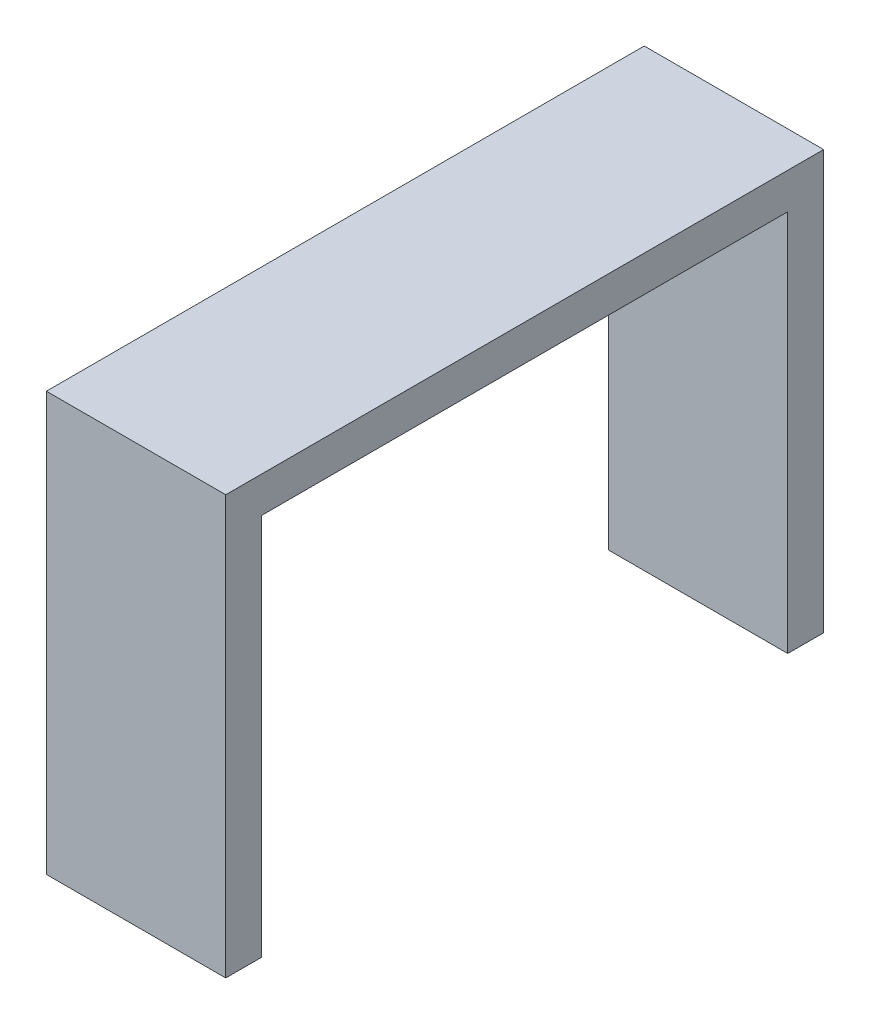
ISO-10303-21;
HEADER;
FILE_DESCRIPTION(('STEP AP214'),'2;1');
FILE_NAME('part.step','',(''),(''),'','','');
FILE_SCHEMA(('AUTOMOTIVE_DESIGN { 1 0 10303 214 1 1 1 1 }'));
ENDSEC;
DATA;
#1=APPLICATION_CONTEXT('core data for automotive mechanical design processes');
#2=APPLICATION_PROTOCOL_DEFINITION('international standard','automotive_design',2000,#1);
#3=PRODUCT_CONTEXT('',#1,'mechanical');
#4=PRODUCT('Part','Part','',(#3));
#5=PRODUCT_RELATED_PRODUCT_CATEGORY('part','',(#4));
#6=PRODUCT_DEFINITION_FORMATION('','',#4);
#7=PRODUCT_DEFINITION_CONTEXT('part definition',#1,'design');
#8=PRODUCT_DEFINITION('design','',#6,#7);
#9=PRODUCT_DEFINITION_SHAPE('','',#8);
#10=(LENGTH_UNIT() NAMED_UNIT(*) SI_UNIT(.MILLI.,.METRE.));
#11=(NAMED_UNIT(*) PLANE_ANGLE_UNIT() SI_UNIT($,.RADIAN.));
#12=(NAMED_UNIT(*) SI_UNIT($,.STERADIAN.) SOLID_ANGLE_UNIT());
#13=UNCERTAINTY_MEASURE_WITH_UNIT(LENGTH_MEASURE(1.E-05),#10,'distance_accuracy_value','');
#14=(GEOMETRIC_REPRESENTATION_CONTEXT(3) GLOBAL_UNCERTAINTY_ASSIGNED_CONTEXT((#13)) GLOBAL_UNIT_ASSIGNED_CONTEXT((#10,
#11,#12)) REPRESENTATION_CONTEXT('',''));
#15=CARTESIAN_POINT('',(0.,0.,0.));
#16=DIRECTION('',(0.,0.,1.));
#17=DIRECTION('',(1.,0.,0.));
#18=AXIS2_PLACEMENT_3D('',#15,#16,#17);
#19=CARTESIAN_POINT('',(24.3884877159542,74.,0.));
#20=DIRECTION('',(1.,0.,0.));
#21=DIRECTION('',(0.,0.,-1.));
#22=AXIS2_PLACEMENT_3D('',#19,#20,#21);
#23=PLANE('',#22);
#24=DIRECTION('',(0.,0.,1.));
#25=VECTOR('',#24,1.);
#26=CARTESIAN_POINT('',(24.3884877159542,4.,0.));
#27=LINE('',#26,#25);
#28=CARTESIAN_POINT('',(24.3884877159542,4.,-6.00000000000001));
#29=VERTEX_POINT('',#28);
#30=CARTESIAN_POINT('',(24.3884877159542,4.,0.));
#31=VERTEX_POINT('',#30);
#32=EDGE_CURVE('E11',#29,#31,#27,.T.);
#33=ORIENTED_EDGE('',*,*,#32,.T.);
#34=DIRECTION('',(0.,-1.,0.));
#35=VECTOR('',#34,1.);
#36=CARTESIAN_POINT('',(24.3884877159542,74.,0.));
#37=LINE('',#36,#35);
#38=CARTESIAN_POINT('',(24.3884877159542,74.,0.));
#39=VERTEX_POINT('',#38);
#40=EDGE_CURVE('E162',#39,#31,#37,.T.);
#41=ORIENTED_EDGE('',*,*,#40,.F.);
#42=DIRECTION('',(0.,0.,1.));
#43=VECTOR('',#42,1.);
#44=CARTESIAN_POINT('',(24.3884877159542,74.,0.));
#45=LINE('',#44,#43);
#46=CARTESIAN_POINT('',(24.3884877159542,74.,-100.));
#47=VERTEX_POINT('',#46);
#48=EDGE_CURVE('E45',#47,#39,#45,.T.);
#49=ORIENTED_EDGE('',*,*,#48,.F.);
#50=DIRECTION('',(0.,-1.,0.));
#51=VECTOR('',#50,1.);
#52=CARTESIAN_POINT('',(24.3884877159542,74.,-100.));
#53=LINE('',#52,#51);
#54=CARTESIAN_POINT('',(24.3884877159542,4.,-100.));
#55=VERTEX_POINT('',#54);
#56=EDGE_CURVE('E135',#47,#55,#53,.T.);
#57=ORIENTED_EDGE('',*,*,#56,.T.);
#58=DIRECTION('',(0.,0.,1.));
#59=VECTOR('',#58,1.);
#60=CARTESIAN_POINT('',(24.3884877159542,4.,-100.));
#61=LINE('',#60,#59);
#62=CARTESIAN_POINT('',(24.3884877159542,4.,-94.));
#63=VERTEX_POINT('',#62);
#64=EDGE_CURVE('E144',#55,#63,#61,.T.);
#65=ORIENTED_EDGE('',*,*,#64,.T.);
#66=DIRECTION('',(0.,-1.,0.));
#67=VECTOR('',#66,1.);
#68=CARTESIAN_POINT('',(24.3884877159542,74.,-94.));
#69=LINE('',#68,#67);
#70=CARTESIAN_POINT('',(24.3884877159542,68.,-94.));
#71=VERTEX_POINT('',#70);
#72=EDGE_CURVE('E152',#71,#63,#69,.T.);
#73=ORIENTED_EDGE('',*,*,#72,.F.);
#74=DIRECTION('',(0.,0.,-1.));
#75=VECTOR('',#74,1.);
#76=CARTESIAN_POINT('',(24.3884877159542,68.,0.002000000000002));
#77=LINE('',#76,#75);
#78=CARTESIAN_POINT('',(24.3884877159542,68.,-6.00000000000001));
#79=VERTEX_POINT('',#78);
#80=EDGE_CURVE('E156',#79,#71,#77,.T.);
#81=ORIENTED_EDGE('',*,*,#80,.F.);
#82=DIRECTION('',(0.,-1.,0.));
#83=VECTOR('',#82,1.);
#84=CARTESIAN_POINT('',(24.3884877159542,74.,-6.00000000000001));
#85=LINE('',#84,#83);
#86=EDGE_CURVE('E87',#79,#29,#85,.T.);
#87=ORIENTED_EDGE('',*,*,#86,.T.);
#88=EDGE_LOOP('',(#33,#41,#49,#57,#65,#73,#81,#87));
#89=FACE_BOUND('',#88,.T.);
#90=ADVANCED_FACE('F41',(#89),#23,.F.);
#91=CARTESIAN_POINT('',(24.3884877159542,74.,0.));
#92=DIRECTION('',(0.,0.,-1.));
#93=DIRECTION('',(-1.,0.,0.));
#94=AXIS2_PLACEMENT_3D('',#91,#92,#93);
#95=PLANE('',#94);
#96=DIRECTION('',(1.,0.,0.));
#97=VECTOR('',#96,1.);
#98=CARTESIAN_POINT('',(24.3884877159542,4.,0.));
#99=LINE('',#98,#97);
#100=CARTESIAN_POINT('',(54.3884877159542,4.,0.));
#101=VERTEX_POINT('',#100);
#102=EDGE_CURVE('E50',#31,#101,#99,.T.);
#103=ORIENTED_EDGE('',*,*,#102,.T.);
#104=DIRECTION('',(0.,-1.,0.));
#105=VECTOR('',#104,1.);
#106=CARTESIAN_POINT('',(54.3884877159542,74.,0.));
#107=LINE('',#106,#105);
#108=CARTESIAN_POINT('',(54.3884877159542,74.,0.));
#109=VERTEX_POINT('',#108);
#110=EDGE_CURVE('E164',#109,#101,#107,.T.);
#111=ORIENTED_EDGE('',*,*,#110,.F.);
#112=DIRECTION('',(1.,0.,0.));
#113=VECTOR('',#112,1.);
#114=CARTESIAN_POINT('',(24.3884877159542,74.,0.));
#115=LINE('',#114,#113);
#116=EDGE_CURVE('E80',#39,#109,#115,.T.);
#117=ORIENTED_EDGE('',*,*,#116,.F.);
#118=ORIENTED_EDGE('',*,*,#40,.T.);
#119=EDGE_LOOP('',(#103,#111,#117,#118));
#120=FACE_BOUND('',#119,.T.);
#121=ADVANCED_FACE('F174',(#120),#95,.F.);
#122=CARTESIAN_POINT('',(54.3884877159542,74.,0.));
#123=DIRECTION('',(-1.,0.,0.));
#124=DIRECTION('',(0.,0.,1.));
#125=AXIS2_PLACEMENT_3D('',#122,#123,#124);
#126=PLANE('',#125);
#127=DIRECTION('',(0.,0.,-1.));
#128=VECTOR('',#127,1.);
#129=CARTESIAN_POINT('',(54.3884877159542,4.,0.));
#130=LINE('',#129,#128);
#131=CARTESIAN_POINT('',(54.3884877159542,4.,-6.00000000000001));
#132=VERTEX_POINT('',#131);
#133=EDGE_CURVE('E171',#101,#132,#130,.T.);
#134=ORIENTED_EDGE('',*,*,#133,.T.);
#135=DIRECTION('',(0.,-1.,0.));
#136=VECTOR('',#135,1.);
#137=CARTESIAN_POINT('',(54.3884877159542,74.,-6.00000000000001));
#138=LINE('',#137,#136);
#139=CARTESIAN_POINT('',(54.3884877159542,68.,-6.00000000000001));
#140=VERTEX_POINT('',#139);
#141=EDGE_CURVE('E166',#140,#132,#138,.T.);
#142=ORIENTED_EDGE('',*,*,#141,.F.);
#143=DIRECTION('',(0.,0.,-1.));
#144=VECTOR('',#143,1.);
#145=CARTESIAN_POINT('',(54.3884877159542,68.,0.002000000000002));
#146=LINE('',#145,#144);
#147=CARTESIAN_POINT('',(54.3884877159542,68.,-94.));
#148=VERTEX_POINT('',#147);
#149=EDGE_CURVE('E58',#140,#148,#146,.T.);
#150=ORIENTED_EDGE('',*,*,#149,.T.);
#151=DIRECTION('',(0.,-1.,0.));
#152=VECTOR('',#151,1.);
#153=CARTESIAN_POINT('',(54.3884877159542,74.,-94.));
#154=LINE('',#153,#152);
#155=CARTESIAN_POINT('',(54.3884877159542,4.,-94.));
#156=VERTEX_POINT('',#155);
#157=EDGE_CURVE('E134',#148,#156,#154,.T.);
#158=ORIENTED_EDGE('',*,*,#157,.T.);
#159=DIRECTION('',(0.,0.,-1.));
#160=VECTOR('',#159,1.);
#161=CARTESIAN_POINT('',(54.3884877159542,4.,-100.));
#162=LINE('',#161,#160);
#163=CARTESIAN_POINT('',(54.3884877159542,4.,-100.));
#164=VERTEX_POINT('',#163);
#165=EDGE_CURVE('E131',#156,#164,#162,.T.);
#166=ORIENTED_EDGE('',*,*,#165,.T.);
#167=DIRECTION('',(0.,-1.,0.));
#168=VECTOR('',#167,1.);
#169=CARTESIAN_POINT('',(54.3884877159542,74.,-100.));
#170=LINE('',#169,#168);
#171=CARTESIAN_POINT('',(54.3884877159542,74.,-100.));
#172=VERTEX_POINT('',#171);
#173=EDGE_CURVE('E127',#172,#164,#170,.T.);
#174=ORIENTED_EDGE('',*,*,#173,.F.);
#175=DIRECTION('',(0.,0.,-1.));
#176=VECTOR('',#175,1.);
#177=CARTESIAN_POINT('',(54.3884877159542,74.,0.));
#178=LINE('',#177,#176);
#179=EDGE_CURVE('E118',#109,#172,#178,.T.);
#180=ORIENTED_EDGE('',*,*,#179,.F.);
#181=ORIENTED_EDGE('',*,*,#110,.T.);
#182=EDGE_LOOP('',(#134,#142,#150,#158,#166,#174,#180,#181));
#183=FACE_BOUND('',#182,.T.);
#184=ADVANCED_FACE('F129',(#183),#126,.F.);
#185=CARTESIAN_POINT('',(24.3884877159542,74.,-6.00000000000001));
#186=DIRECTION('',(0.,0.,1.));
#187=DIRECTION('',(1.,0.,0.));
#188=AXIS2_PLACEMENT_3D('',#185,#186,#187);
#189=PLANE('',#188);
#190=ORIENTED_EDGE('',*,*,#86,.F.);
#191=DIRECTION('',(1.,0.,0.));
#192=VECTOR('',#191,1.);
#193=CARTESIAN_POINT('',(24.3884877159542,68.,-6.00000000000001));
#194=LINE('',#193,#192);
#195=EDGE_CURVE('E159',#79,#140,#194,.T.);
#196=ORIENTED_EDGE('',*,*,#195,.T.);
#197=ORIENTED_EDGE('',*,*,#141,.T.);
#198=DIRECTION('',(-1.,0.,0.));
#199=VECTOR('',#198,1.);
#200=CARTESIAN_POINT('',(24.3884877159542,4.,-6.00000000000001));
#201=LINE('',#200,#199);
#202=EDGE_CURVE('E169',#132,#29,#201,.T.);
#203=ORIENTED_EDGE('',*,*,#202,.T.);
#204=EDGE_LOOP('',(#190,#196,#197,#203));
#205=FACE_BOUND('',#204,.T.);
#206=ADVANCED_FACE('F179',(#205),#189,.F.);
#207=CARTESIAN_POINT('',(0.,74.,0.));
#208=DIRECTION('',(0.,-1.,0.));
#209=DIRECTION('',(0.,0.,-1.));
#210=AXIS2_PLACEMENT_3D('',#207,#208,#209);
#211=PLANE('',#210);
#212=ORIENTED_EDGE('',*,*,#48,.T.);
#213=ORIENTED_EDGE('',*,*,#116,.T.);
#214=ORIENTED_EDGE('',*,*,#179,.T.);
#215=DIRECTION('',(-1.,0.,0.));
#216=VECTOR('',#215,1.);
#217=CARTESIAN_POINT('',(24.3884877159542,74.,-100.));
#218=LINE('',#217,#216);
#219=EDGE_CURVE('E121',#172,#47,#218,.T.);
#220=ORIENTED_EDGE('',*,*,#219,.T.);
#221=EDGE_LOOP('',(#212,#213,#214,#220));
#222=FACE_BOUND('',#221,.T.);
#223=ADVANCED_FACE('F43',(#222),#211,.F.);
#224=CARTESIAN_POINT('',(0.,4.,0.));
#225=DIRECTION('',(0.,-1.,0.));
#226=DIRECTION('',(0.,0.,-1.));
#227=AXIS2_PLACEMENT_3D('',#224,#225,#226);
#228=PLANE('',#227);
#229=ORIENTED_EDGE('',*,*,#32,.F.);
#230=ORIENTED_EDGE('',*,*,#202,.F.);
#231=ORIENTED_EDGE('',*,*,#133,.F.);
#232=ORIENTED_EDGE('',*,*,#102,.F.);
#233=EDGE_LOOP('',(#229,#230,#231,#232));
#234=FACE_BOUND('',#233,.T.);
#235=ADVANCED_FACE('F177',(#234),#228,.T.);
#236=CARTESIAN_POINT('',(24.3884877159542,68.,0.002000000000002));
#237=DIRECTION('',(0.,1.,0.));
#238=DIRECTION('',(0.,0.,1.));
#239=AXIS2_PLACEMENT_3D('',#236,#237,#238);
#240=PLANE('',#239);
#241=ORIENTED_EDGE('',*,*,#195,.F.);
#242=ORIENTED_EDGE('',*,*,#80,.T.);
#243=DIRECTION('',(1.,0.,0.));
#244=VECTOR('',#243,1.);
#245=CARTESIAN_POINT('',(24.3884877159542,68.,-94.));
#246=LINE('',#245,#244);
#247=EDGE_CURVE('E154',#71,#148,#246,.T.);
#248=ORIENTED_EDGE('',*,*,#247,.T.);
#249=ORIENTED_EDGE('',*,*,#149,.F.);
#250=EDGE_LOOP('',(#241,#242,#248,#249));
#251=FACE_BOUND('',#250,.T.);
#252=ADVANCED_FACE('F180',(#251),#240,.F.);
#253=CARTESIAN_POINT('',(24.3884877159542,74.,-94.));
#254=DIRECTION('',(0.,0.,-1.));
#255=DIRECTION('',(-1.,0.,0.));
#256=AXIS2_PLACEMENT_3D('',#253,#254,#255);
#257=PLANE('',#256);
#258=ORIENTED_EDGE('',*,*,#247,.F.);
#259=ORIENTED_EDGE('',*,*,#72,.T.);
#260=DIRECTION('',(1.,0.,0.));
#261=VECTOR('',#260,1.);
#262=CARTESIAN_POINT('',(24.3884877159542,4.,-94.));
#263=LINE('',#262,#261);
#264=EDGE_CURVE('E147',#63,#156,#263,.T.);
#265=ORIENTED_EDGE('',*,*,#264,.T.);
#266=ORIENTED_EDGE('',*,*,#157,.F.);
#267=EDGE_LOOP('',(#258,#259,#265,#266));
#268=FACE_BOUND('',#267,.T.);
#269=ADVANCED_FACE('F183',(#268),#257,.F.);
#270=CARTESIAN_POINT('',(24.3884877159542,74.,-100.));
#271=DIRECTION('',(0.,0.,1.));
#272=DIRECTION('',(1.,0.,0.));
#273=AXIS2_PLACEMENT_3D('',#270,#271,#272);
#274=PLANE('',#273);
#275=DIRECTION('',(-1.,0.,0.));
#276=VECTOR('',#275,1.);
#277=CARTESIAN_POINT('',(24.3884877159542,4.,-100.));
#278=LINE('',#277,#276);
#279=EDGE_CURVE('E139',#164,#55,#278,.T.);
#280=ORIENTED_EDGE('',*,*,#279,.T.);
#281=ORIENTED_EDGE('',*,*,#56,.F.);
#282=ORIENTED_EDGE('',*,*,#219,.F.);
#283=ORIENTED_EDGE('',*,*,#173,.T.);
#284=EDGE_LOOP('',(#280,#281,#282,#283));
#285=FACE_BOUND('',#284,.T.);
#286=ADVANCED_FACE('F137',(#285),#274,.F.);
#287=CARTESIAN_POINT('',(0.,4.,0.));
#288=DIRECTION('',(0.,1.,0.));
#289=DIRECTION('',(0.,0.,1.));
#290=AXIS2_PLACEMENT_3D('',#287,#288,#289);
#291=PLANE('',#290);
#292=ORIENTED_EDGE('',*,*,#64,.F.);
#293=ORIENTED_EDGE('',*,*,#279,.F.);
#294=ORIENTED_EDGE('',*,*,#165,.F.);
#295=ORIENTED_EDGE('',*,*,#264,.F.);
#296=EDGE_LOOP('',(#292,#293,#294,#295));
#297=FACE_BOUND('',#296,.T.);
#298=ADVANCED_FACE('F187',(#297),#291,.F.);
#299=CLOSED_SHELL('',(#90,#121,#184,#206,#223,#235,#252,#269,#286,#298));
#300=MANIFOLD_SOLID_BREP('B2',#299);
#301=ADVANCED_BREP_SHAPE_REPRESENTATION('',(#18,#300),#14);
#302=SHAPE_DEFINITION_REPRESENTATION(#9,#301);
ENDSEC;
END-ISO-10303-21;
